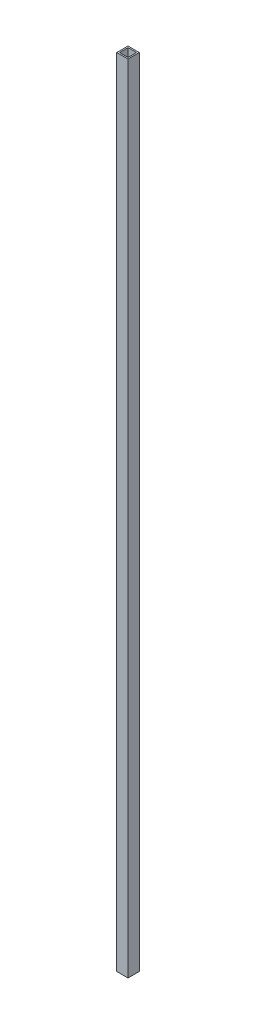
ISO-10303-21;
HEADER;
FILE_DESCRIPTION(('STEP AP214'),'2;1');
FILE_NAME('part.step','',(''),(''),'','','');
FILE_SCHEMA(('AUTOMOTIVE_DESIGN { 1 0 10303 214 1 1 1 1 }'));
ENDSEC;
DATA;
#1=APPLICATION_CONTEXT('core data for automotive mechanical design processes');
#2=APPLICATION_PROTOCOL_DEFINITION('international standard','automotive_design',2000,#1);
#3=PRODUCT_CONTEXT('',#1,'mechanical');
#4=PRODUCT('Part','Part','',(#3));
#5=PRODUCT_RELATED_PRODUCT_CATEGORY('part','',(#4));
#6=PRODUCT_DEFINITION_FORMATION('','',#4);
#7=PRODUCT_DEFINITION_CONTEXT('part definition',#1,'design');
#8=PRODUCT_DEFINITION('design','',#6,#7);
#9=PRODUCT_DEFINITION_SHAPE('','',#8);
#10=(LENGTH_UNIT() NAMED_UNIT(*) SI_UNIT(.MILLI.,.METRE.));
#11=(NAMED_UNIT(*) PLANE_ANGLE_UNIT() SI_UNIT($,.RADIAN.));
#12=(NAMED_UNIT(*) SI_UNIT($,.STERADIAN.) SOLID_ANGLE_UNIT());
#13=UNCERTAINTY_MEASURE_WITH_UNIT(LENGTH_MEASURE(1.E-05),#10,'distance_accuracy_value','');
#14=(GEOMETRIC_REPRESENTATION_CONTEXT(3) GLOBAL_UNCERTAINTY_ASSIGNED_CONTEXT((#13)) GLOBAL_UNIT_ASSIGNED_CONTEXT((#10,
#11,#12)) REPRESENTATION_CONTEXT('',''));
#15=CARTESIAN_POINT('',(0.,0.,0.));
#16=DIRECTION('',(0.,0.,1.));
#17=DIRECTION('',(1.,0.,0.));
#18=AXIS2_PLACEMENT_3D('',#15,#16,#17);
#19=CARTESIAN_POINT('',(0.,2817.,0.));
#20=DIRECTION('',(0.,1.,0.));
#21=DIRECTION('',(0.,0.,1.));
#22=AXIS2_PLACEMENT_3D('',#19,#20,#21);
#23=PLANE('',#22);
#24=DIRECTION('',(0.,0.,1.));
#25=VECTOR('',#24,1.);
#26=CARTESIAN_POINT('',(-20.,2817.,20.));
#27=LINE('',#26,#25);
#28=CARTESIAN_POINT('',(-20.,2817.,-20.));
#29=VERTEX_POINT('',#28);
#30=CARTESIAN_POINT('',(-20.,2817.,20.));
#31=VERTEX_POINT('',#30);
#32=EDGE_CURVE('E134',#29,#31,#27,.T.);
#33=ORIENTED_EDGE('',*,*,#32,.T.);
#34=DIRECTION('',(1.,0.,0.));
#35=VECTOR('',#34,1.);
#36=CARTESIAN_POINT('',(20.,2817.,20.));
#37=LINE('',#36,#35);
#38=CARTESIAN_POINT('',(20.,2817.,20.));
#39=VERTEX_POINT('',#38);
#40=EDGE_CURVE('E137',#31,#39,#37,.T.);
#41=ORIENTED_EDGE('',*,*,#40,.T.);
#42=DIRECTION('',(0.,0.,-1.));
#43=VECTOR('',#42,1.);
#44=CARTESIAN_POINT('',(20.,2817.,20.));
#45=LINE('',#44,#43);
#46=CARTESIAN_POINT('',(20.,2817.,-20.));
#47=VERTEX_POINT('',#46);
#48=EDGE_CURVE('E140',#39,#47,#45,.T.);
#49=ORIENTED_EDGE('',*,*,#48,.T.);
#50=DIRECTION('',(-1.,0.,0.));
#51=VECTOR('',#50,1.);
#52=CARTESIAN_POINT('',(20.,2817.,-20.));
#53=LINE('',#52,#51);
#54=EDGE_CURVE('E142',#47,#29,#53,.T.);
#55=ORIENTED_EDGE('',*,*,#54,.T.);
#56=EDGE_LOOP('',(#33,#41,#49,#55));
#57=FACE_BOUND('',#56,.T.);
#58=DIRECTION('',(-1.,0.,0.));
#59=VECTOR('',#58,1.);
#60=CARTESIAN_POINT('',(15.,2817.,-15.));
#61=LINE('',#60,#59);
#62=CARTESIAN_POINT('',(15.,2817.,-15.));
#63=VERTEX_POINT('',#62);
#64=CARTESIAN_POINT('',(-15.,2817.,-15.));
#65=VERTEX_POINT('',#64);
#66=EDGE_CURVE('E106',#63,#65,#61,.T.);
#67=ORIENTED_EDGE('',*,*,#66,.F.);
#68=DIRECTION('',(0.,0.,-1.));
#69=VECTOR('',#68,1.);
#70=CARTESIAN_POINT('',(15.,2817.,15.));
#71=LINE('',#70,#69);
#72=CARTESIAN_POINT('',(15.,2817.,15.));
#73=VERTEX_POINT('',#72);
#74=EDGE_CURVE('E98',#73,#63,#71,.T.);
#75=ORIENTED_EDGE('',*,*,#74,.F.);
#76=DIRECTION('',(1.,0.,0.));
#77=VECTOR('',#76,1.);
#78=CARTESIAN_POINT('',(15.,2817.,15.));
#79=LINE('',#78,#77);
#80=CARTESIAN_POINT('',(-15.,2817.,15.));
#81=VERTEX_POINT('',#80);
#82=EDGE_CURVE('E120',#81,#73,#79,.T.);
#83=ORIENTED_EDGE('',*,*,#82,.F.);
#84=DIRECTION('',(0.,0.,1.));
#85=VECTOR('',#84,1.);
#86=CARTESIAN_POINT('',(-15.,2817.,15.));
#87=LINE('',#86,#85);
#88=EDGE_CURVE('E118',#65,#81,#87,.T.);
#89=ORIENTED_EDGE('',*,*,#88,.F.);
#90=EDGE_LOOP('',(#67,#75,#83,#89));
#91=FACE_BOUND('',#90,.T.);
#92=ADVANCED_FACE('F33',(#57,#91),#23,.T.);
#93=CARTESIAN_POINT('',(0.,0.,0.));
#94=DIRECTION('',(0.,1.,0.));
#95=DIRECTION('',(0.,0.,1.));
#96=AXIS2_PLACEMENT_3D('',#93,#94,#95);
#97=PLANE('',#96);
#98=DIRECTION('',(0.,0.,1.));
#99=VECTOR('',#98,1.);
#100=CARTESIAN_POINT('',(-20.,0.,20.));
#101=LINE('',#100,#99);
#102=CARTESIAN_POINT('',(-20.,0.,-20.));
#103=VERTEX_POINT('',#102);
#104=CARTESIAN_POINT('',(-20.,0.,20.));
#105=VERTEX_POINT('',#104);
#106=EDGE_CURVE('E114',#103,#105,#101,.T.);
#107=ORIENTED_EDGE('',*,*,#106,.F.);
#108=DIRECTION('',(-1.,0.,0.));
#109=VECTOR('',#108,1.);
#110=CARTESIAN_POINT('',(20.,0.,-20.));
#111=LINE('',#110,#109);
#112=CARTESIAN_POINT('',(20.,0.,-20.));
#113=VERTEX_POINT('',#112);
#114=EDGE_CURVE('E138',#113,#103,#111,.T.);
#115=ORIENTED_EDGE('',*,*,#114,.F.);
#116=DIRECTION('',(0.,0.,-1.));
#117=VECTOR('',#116,1.);
#118=CARTESIAN_POINT('',(20.,0.,20.));
#119=LINE('',#118,#117);
#120=CARTESIAN_POINT('',(20.,0.,20.));
#121=VERTEX_POINT('',#120);
#122=EDGE_CURVE('E149',#121,#113,#119,.T.);
#123=ORIENTED_EDGE('',*,*,#122,.F.);
#124=DIRECTION('',(1.,0.,0.));
#125=VECTOR('',#124,1.);
#126=CARTESIAN_POINT('',(20.,0.,20.));
#127=LINE('',#126,#125);
#128=EDGE_CURVE('E147',#105,#121,#127,.T.);
#129=ORIENTED_EDGE('',*,*,#128,.F.);
#130=EDGE_LOOP('',(#107,#115,#123,#129));
#131=FACE_BOUND('',#130,.T.);
#132=DIRECTION('',(0.,0.,-1.));
#133=VECTOR('',#132,1.);
#134=CARTESIAN_POINT('',(15.,0.,15.));
#135=LINE('',#134,#133);
#136=CARTESIAN_POINT('',(15.,0.,15.));
#137=VERTEX_POINT('',#136);
#138=CARTESIAN_POINT('',(15.,0.,-15.));
#139=VERTEX_POINT('',#138);
#140=EDGE_CURVE('E56',#137,#139,#135,.T.);
#141=ORIENTED_EDGE('',*,*,#140,.T.);
#142=DIRECTION('',(-1.,0.,0.));
#143=VECTOR('',#142,1.);
#144=CARTESIAN_POINT('',(15.,0.,-15.));
#145=LINE('',#144,#143);
#146=CARTESIAN_POINT('',(-15.,0.,-15.));
#147=VERTEX_POINT('',#146);
#148=EDGE_CURVE('E113',#139,#147,#145,.T.);
#149=ORIENTED_EDGE('',*,*,#148,.T.);
#150=DIRECTION('',(0.,0.,1.));
#151=VECTOR('',#150,1.);
#152=CARTESIAN_POINT('',(-15.,0.,15.));
#153=LINE('',#152,#151);
#154=CARTESIAN_POINT('',(-15.,0.,15.));
#155=VERTEX_POINT('',#154);
#156=EDGE_CURVE('E126',#147,#155,#153,.T.);
#157=ORIENTED_EDGE('',*,*,#156,.T.);
#158=DIRECTION('',(1.,0.,0.));
#159=VECTOR('',#158,1.);
#160=CARTESIAN_POINT('',(15.,0.,15.));
#161=LINE('',#160,#159);
#162=EDGE_CURVE('E107',#155,#137,#161,.T.);
#163=ORIENTED_EDGE('',*,*,#162,.T.);
#164=EDGE_LOOP('',(#141,#149,#157,#163));
#165=FACE_BOUND('',#164,.T.);
#166=ADVANCED_FACE('F167',(#131,#165),#97,.F.);
#167=CARTESIAN_POINT('',(-20.,2817.,20.));
#168=DIRECTION('',(1.,0.,0.));
#169=DIRECTION('',(0.,0.,-1.));
#170=AXIS2_PLACEMENT_3D('',#167,#168,#169);
#171=PLANE('',#170);
#172=ORIENTED_EDGE('',*,*,#106,.T.);
#173=DIRECTION('',(0.,-1.,0.));
#174=VECTOR('',#173,1.);
#175=CARTESIAN_POINT('',(-20.,2817.,20.));
#176=LINE('',#175,#174);
#177=EDGE_CURVE('E11',#31,#105,#176,.T.);
#178=ORIENTED_EDGE('',*,*,#177,.F.);
#179=ORIENTED_EDGE('',*,*,#32,.F.);
#180=DIRECTION('',(0.,-1.,0.));
#181=VECTOR('',#180,1.);
#182=CARTESIAN_POINT('',(-20.,2817.,-20.));
#183=LINE('',#182,#181);
#184=EDGE_CURVE('E144',#29,#103,#183,.T.);
#185=ORIENTED_EDGE('',*,*,#184,.T.);
#186=EDGE_LOOP('',(#172,#178,#179,#185));
#187=FACE_BOUND('',#186,.T.);
#188=ADVANCED_FACE('F35',(#187),#171,.F.);
#189=CARTESIAN_POINT('',(20.,2817.,20.));
#190=DIRECTION('',(0.,0.,-1.));
#191=DIRECTION('',(-1.,0.,0.));
#192=AXIS2_PLACEMENT_3D('',#189,#190,#191);
#193=PLANE('',#192);
#194=ORIENTED_EDGE('',*,*,#128,.T.);
#195=DIRECTION('',(0.,-1.,0.));
#196=VECTOR('',#195,1.);
#197=CARTESIAN_POINT('',(20.,2817.,20.));
#198=LINE('',#197,#196);
#199=EDGE_CURVE('E41',#39,#121,#198,.T.);
#200=ORIENTED_EDGE('',*,*,#199,.F.);
#201=ORIENTED_EDGE('',*,*,#40,.F.);
#202=ORIENTED_EDGE('',*,*,#177,.T.);
#203=EDGE_LOOP('',(#194,#200,#201,#202));
#204=FACE_BOUND('',#203,.T.);
#205=ADVANCED_FACE('F177',(#204),#193,.F.);
#206=CARTESIAN_POINT('',(20.,2817.,20.));
#207=DIRECTION('',(-1.,0.,0.));
#208=DIRECTION('',(0.,0.,1.));
#209=AXIS2_PLACEMENT_3D('',#206,#207,#208);
#210=PLANE('',#209);
#211=ORIENTED_EDGE('',*,*,#122,.T.);
#212=DIRECTION('',(0.,-1.,0.));
#213=VECTOR('',#212,1.);
#214=CARTESIAN_POINT('',(20.,2817.,-20.));
#215=LINE('',#214,#213);
#216=EDGE_CURVE('E154',#47,#113,#215,.T.);
#217=ORIENTED_EDGE('',*,*,#216,.F.);
#218=ORIENTED_EDGE('',*,*,#48,.F.);
#219=ORIENTED_EDGE('',*,*,#199,.T.);
#220=EDGE_LOOP('',(#211,#217,#218,#219));
#221=FACE_BOUND('',#220,.T.);
#222=ADVANCED_FACE('F161',(#221),#210,.F.);
#223=CARTESIAN_POINT('',(20.,2817.,-20.));
#224=DIRECTION('',(0.,0.,1.));
#225=DIRECTION('',(1.,0.,0.));
#226=AXIS2_PLACEMENT_3D('',#223,#224,#225);
#227=PLANE('',#226);
#228=ORIENTED_EDGE('',*,*,#114,.T.);
#229=ORIENTED_EDGE('',*,*,#184,.F.);
#230=ORIENTED_EDGE('',*,*,#54,.F.);
#231=ORIENTED_EDGE('',*,*,#216,.T.);
#232=EDGE_LOOP('',(#228,#229,#230,#231));
#233=FACE_BOUND('',#232,.T.);
#234=ADVANCED_FACE('F171',(#233),#227,.F.);
#235=CARTESIAN_POINT('',(15.,2817.,15.));
#236=DIRECTION('',(-1.,0.,0.));
#237=DIRECTION('',(0.,0.,1.));
#238=AXIS2_PLACEMENT_3D('',#235,#236,#237);
#239=PLANE('',#238);
#240=ORIENTED_EDGE('',*,*,#140,.F.);
#241=DIRECTION('',(0.,-1.,0.));
#242=VECTOR('',#241,1.);
#243=CARTESIAN_POINT('',(15.,2817.,15.));
#244=LINE('',#243,#242);
#245=EDGE_CURVE('E102',#73,#137,#244,.T.);
#246=ORIENTED_EDGE('',*,*,#245,.F.);
#247=ORIENTED_EDGE('',*,*,#74,.T.);
#248=DIRECTION('',(0.,-1.,0.));
#249=VECTOR('',#248,1.);
#250=CARTESIAN_POINT('',(15.,2817.,-15.));
#251=LINE('',#250,#249);
#252=EDGE_CURVE('E101',#63,#139,#251,.T.);
#253=ORIENTED_EDGE('',*,*,#252,.T.);
#254=EDGE_LOOP('',(#240,#246,#247,#253));
#255=FACE_BOUND('',#254,.T.);
#256=ADVANCED_FACE('F100',(#255),#239,.T.);
#257=CARTESIAN_POINT('',(15.,2817.,-15.));
#258=DIRECTION('',(0.,0.,1.));
#259=DIRECTION('',(1.,0.,0.));
#260=AXIS2_PLACEMENT_3D('',#257,#258,#259);
#261=PLANE('',#260);
#262=ORIENTED_EDGE('',*,*,#148,.F.);
#263=ORIENTED_EDGE('',*,*,#252,.F.);
#264=ORIENTED_EDGE('',*,*,#66,.T.);
#265=DIRECTION('',(0.,-1.,0.));
#266=VECTOR('',#265,1.);
#267=CARTESIAN_POINT('',(-15.,2817.,-15.));
#268=LINE('',#267,#266);
#269=EDGE_CURVE('E115',#65,#147,#268,.T.);
#270=ORIENTED_EDGE('',*,*,#269,.T.);
#271=EDGE_LOOP('',(#262,#263,#264,#270));
#272=FACE_BOUND('',#271,.T.);
#273=ADVANCED_FACE('F110',(#272),#261,.T.);
#274=CARTESIAN_POINT('',(-15.,2817.,15.));
#275=DIRECTION('',(1.,0.,0.));
#276=DIRECTION('',(0.,0.,-1.));
#277=AXIS2_PLACEMENT_3D('',#274,#275,#276);
#278=PLANE('',#277);
#279=ORIENTED_EDGE('',*,*,#156,.F.);
#280=ORIENTED_EDGE('',*,*,#269,.F.);
#281=ORIENTED_EDGE('',*,*,#88,.T.);
#282=DIRECTION('',(0.,-1.,0.));
#283=VECTOR('',#282,1.);
#284=CARTESIAN_POINT('',(-15.,2817.,15.));
#285=LINE('',#284,#283);
#286=EDGE_CURVE('E48',#81,#155,#285,.T.);
#287=ORIENTED_EDGE('',*,*,#286,.T.);
#288=EDGE_LOOP('',(#279,#280,#281,#287));
#289=FACE_BOUND('',#288,.T.);
#290=ADVANCED_FACE('F200',(#289),#278,.T.);
#291=CARTESIAN_POINT('',(15.,2817.,15.));
#292=DIRECTION('',(0.,0.,-1.));
#293=DIRECTION('',(-1.,0.,0.));
#294=AXIS2_PLACEMENT_3D('',#291,#292,#293);
#295=PLANE('',#294);
#296=ORIENTED_EDGE('',*,*,#162,.F.);
#297=ORIENTED_EDGE('',*,*,#286,.F.);
#298=ORIENTED_EDGE('',*,*,#82,.T.);
#299=ORIENTED_EDGE('',*,*,#245,.T.);
#300=EDGE_LOOP('',(#296,#297,#298,#299));
#301=FACE_BOUND('',#300,.T.);
#302=ADVANCED_FACE('F204',(#301),#295,.T.);
#303=CLOSED_SHELL('',(#92,#166,#188,#205,#222,#234,#256,#273,#290,#302));
#304=MANIFOLD_SOLID_BREP('B2',#303);
#305=ADVANCED_BREP_SHAPE_REPRESENTATION('',(#18,#304),#14);
#306=SHAPE_DEFINITION_REPRESENTATION(#9,#305);
ENDSEC;
END-ISO-10303-21;
